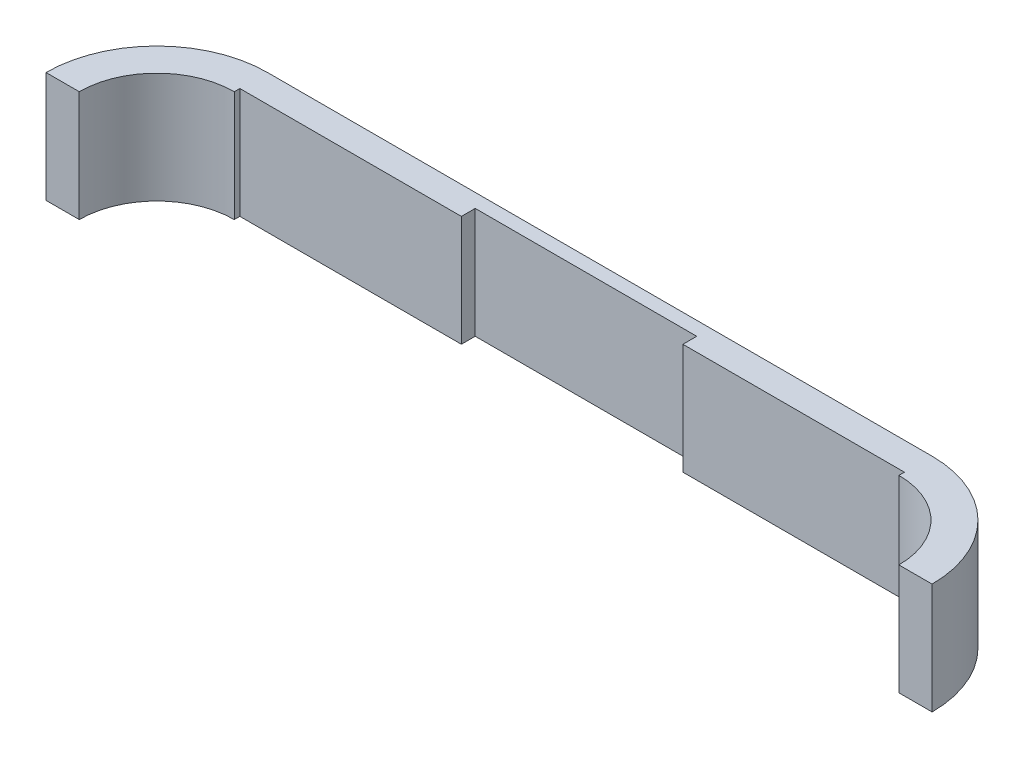
ISO-10303-21;
HEADER;
FILE_DESCRIPTION(('STEP AP214'),'2;1');
FILE_NAME('part.step','',(''),(''),'','','');
FILE_SCHEMA(('AUTOMOTIVE_DESIGN { 1 0 10303 214 1 1 1 1 }'));
ENDSEC;
DATA;
#1=APPLICATION_CONTEXT('core data for automotive mechanical design processes');
#2=APPLICATION_PROTOCOL_DEFINITION('international standard','automotive_design',2000,#1);
#3=PRODUCT_CONTEXT('',#1,'mechanical');
#4=PRODUCT('Part','Part','',(#3));
#5=PRODUCT_RELATED_PRODUCT_CATEGORY('part','',(#4));
#6=PRODUCT_DEFINITION_FORMATION('','',#4);
#7=PRODUCT_DEFINITION_CONTEXT('part definition',#1,'design');
#8=PRODUCT_DEFINITION('design','',#6,#7);
#9=PRODUCT_DEFINITION_SHAPE('','',#8);
#10=(LENGTH_UNIT() NAMED_UNIT(*) SI_UNIT(.MILLI.,.METRE.));
#11=(NAMED_UNIT(*) PLANE_ANGLE_UNIT() SI_UNIT($,.RADIAN.));
#12=(NAMED_UNIT(*) SI_UNIT($,.STERADIAN.) SOLID_ANGLE_UNIT());
#13=UNCERTAINTY_MEASURE_WITH_UNIT(LENGTH_MEASURE(1.E-05),#10,'distance_accuracy_value','');
#14=(GEOMETRIC_REPRESENTATION_CONTEXT(3) GLOBAL_UNCERTAINTY_ASSIGNED_CONTEXT((#13)) GLOBAL_UNIT_ASSIGNED_CONTEXT((#10,
#11,#12)) REPRESENTATION_CONTEXT('',''));
#15=CARTESIAN_POINT('',(0.,0.,0.));
#16=DIRECTION('',(0.,0.,1.));
#17=DIRECTION('',(1.,0.,0.));
#18=AXIS2_PLACEMENT_3D('',#15,#16,#17);
#19=CARTESIAN_POINT('',(0.,2000.,5133.84624820078));
#20=DIRECTION('',(0.,0.,-1.));
#21=DIRECTION('',(-1.,0.,0.));
#22=AXIS2_PLACEMENT_3D('',#19,#20,#21);
#23=PLANE('',#22);
#24=DIRECTION('',(1.,0.,0.));
#25=VECTOR('',#24,1.);
#26=CARTESIAN_POINT('',(0.,0.,5133.84624820078));
#27=LINE('',#26,#25);
#28=CARTESIAN_POINT('',(4435.15250386494,0.,5133.84624820078));
#29=VERTEX_POINT('',#28);
#30=CARTESIAN_POINT('',(16435.1525038649,0.,5133.84624820078));
#31=VERTEX_POINT('',#30);
#32=EDGE_CURVE('E167',#29,#31,#27,.T.);
#33=ORIENTED_EDGE('',*,*,#32,.F.);
#34=DIRECTION('',(0.,-1.,0.));
#35=VECTOR('',#34,1.);
#36=CARTESIAN_POINT('',(4435.15250386494,2000.,5133.84624820078));
#37=LINE('',#36,#35);
#38=CARTESIAN_POINT('',(4435.15250386494,2000.,5133.84624820078));
#39=VERTEX_POINT('',#38);
#40=EDGE_CURVE('E11',#39,#29,#37,.T.);
#41=ORIENTED_EDGE('',*,*,#40,.F.);
#42=DIRECTION('',(1.,0.,0.));
#43=VECTOR('',#42,1.);
#44=CARTESIAN_POINT('',(0.,2000.,5133.84624820078));
#45=LINE('',#44,#43);
#46=CARTESIAN_POINT('',(16435.1525038649,2000.,5133.84624820078));
#47=VERTEX_POINT('',#46);
#48=EDGE_CURVE('E202',#39,#47,#45,.T.);
#49=ORIENTED_EDGE('',*,*,#48,.T.);
#50=DIRECTION('',(0.,-1.,0.));
#51=VECTOR('',#50,1.);
#52=CARTESIAN_POINT('',(16435.1525038649,2000.,5133.84624820078));
#53=LINE('',#52,#51);
#54=EDGE_CURVE('E54',#47,#31,#53,.T.);
#55=ORIENTED_EDGE('',*,*,#54,.T.);
#56=EDGE_LOOP('',(#33,#41,#49,#55));
#57=FACE_BOUND('',#56,.T.);
#58=ADVANCED_FACE('F38',(#57),#23,.T.);
#59=CARTESIAN_POINT('',(4435.15250386493,2000.,7133.84624820078));
#60=DIRECTION('',(0.,-1.,0.));
#61=DIRECTION('',(0.,0.,-1.));
#62=AXIS2_PLACEMENT_3D('',#59,#60,#61);
#63=CYLINDRICAL_SURFACE('',#62,2000.);
#64=CARTESIAN_POINT('',(4435.15250386493,0.,7133.84624820078));
#65=DIRECTION('',(0.,1.,0.));
#66=DIRECTION('',(0.,0.,1.));
#67=AXIS2_PLACEMENT_3D('',#64,#65,#66);
#68=CIRCLE('',#67,2000.);
#69=CARTESIAN_POINT('',(2435.15250386493,0.,7133.84624820079));
#70=VERTEX_POINT('',#69);
#71=EDGE_CURVE('E169',#29,#70,#68,.T.);
#72=ORIENTED_EDGE('',*,*,#71,.T.);
#73=DIRECTION('',(0.,-1.,0.));
#74=VECTOR('',#73,1.);
#75=CARTESIAN_POINT('',(2435.15250386493,2000.,7133.84624820079));
#76=LINE('',#75,#74);
#77=CARTESIAN_POINT('',(2435.15250386493,2000.,7133.84624820079));
#78=VERTEX_POINT('',#77);
#79=EDGE_CURVE('E46',#78,#70,#76,.T.);
#80=ORIENTED_EDGE('',*,*,#79,.F.);
#81=CARTESIAN_POINT('',(4435.15250386493,2000.,7133.84624820078));
#82=DIRECTION('',(0.,1.,0.));
#83=DIRECTION('',(0.,0.,1.));
#84=AXIS2_PLACEMENT_3D('',#81,#82,#83);
#85=CIRCLE('',#84,2000.);
#86=EDGE_CURVE('E248',#39,#78,#85,.T.);
#87=ORIENTED_EDGE('',*,*,#86,.F.);
#88=ORIENTED_EDGE('',*,*,#40,.T.);
#89=EDGE_LOOP('',(#72,#80,#87,#88));
#90=FACE_BOUND('',#89,.T.);
#91=ADVANCED_FACE('F278',(#90),#63,.T.);
#92=CARTESIAN_POINT('',(5.06890262968853E-11,2000.,7133.84624820081));
#93=DIRECTION('',(0.,0.,-1.));
#94=DIRECTION('',(-1.,0.,0.));
#95=AXIS2_PLACEMENT_3D('',#92,#93,#94);
#96=PLANE('',#95);
#97=DIRECTION('',(1.,0.,0.));
#98=VECTOR('',#97,1.);
#99=CARTESIAN_POINT('',(5.06890262968853E-11,0.,7133.84624820081));
#100=LINE('',#99,#98);
#101=CARTESIAN_POINT('',(3035.15250386493,0.,7133.84624820079));
#102=VERTEX_POINT('',#101);
#103=EDGE_CURVE('E171',#70,#102,#100,.T.);
#104=ORIENTED_EDGE('',*,*,#103,.T.);
#105=DIRECTION('',(0.,-1.,0.));
#106=VECTOR('',#105,1.);
#107=CARTESIAN_POINT('',(3035.15250386493,2000.,7133.84624820079));
#108=LINE('',#107,#106);
#109=CARTESIAN_POINT('',(3035.15250386493,2000.,7133.84624820079));
#110=VERTEX_POINT('',#109);
#111=EDGE_CURVE('E222',#110,#102,#108,.T.);
#112=ORIENTED_EDGE('',*,*,#111,.F.);
#113=DIRECTION('',(1.,0.,0.));
#114=VECTOR('',#113,1.);
#115=CARTESIAN_POINT('',(5.06890262968853E-11,2000.,7133.84624820081));
#116=LINE('',#115,#114);
#117=EDGE_CURVE('E230',#78,#110,#116,.T.);
#118=ORIENTED_EDGE('',*,*,#117,.F.);
#119=ORIENTED_EDGE('',*,*,#79,.T.);
#120=EDGE_LOOP('',(#104,#112,#118,#119));
#121=FACE_BOUND('',#120,.T.);
#122=ADVANCED_FACE('F228',(#121),#96,.F.);
#123=CARTESIAN_POINT('',(4435.15250386493,2000.,7133.84624820078));
#124=DIRECTION('',(0.,-1.,0.));
#125=DIRECTION('',(0.,0.,-1.));
#126=AXIS2_PLACEMENT_3D('',#123,#124,#125);
#127=CYLINDRICAL_SURFACE('',#126,1400.);
#128=CARTESIAN_POINT('',(4435.15250386493,0.,7133.84624820078));
#129=DIRECTION('',(0.,1.,0.));
#130=DIRECTION('',(0.,0.,1.));
#131=AXIS2_PLACEMENT_3D('',#128,#129,#130);
#132=CIRCLE('',#131,1400.);
#133=CARTESIAN_POINT('',(4435.15250386494,0.,5733.84624820078));
#134=VERTEX_POINT('',#133);
#135=EDGE_CURVE('E174',#134,#102,#132,.T.);
#136=ORIENTED_EDGE('',*,*,#135,.F.);
#137=DIRECTION('',(0.,-1.,0.));
#138=VECTOR('',#137,1.);
#139=CARTESIAN_POINT('',(4435.15250386494,2000.,5733.84624820078));
#140=LINE('',#139,#138);
#141=CARTESIAN_POINT('',(4435.15250386494,2000.,5733.84624820078));
#142=VERTEX_POINT('',#141);
#143=EDGE_CURVE('E220',#142,#134,#140,.T.);
#144=ORIENTED_EDGE('',*,*,#143,.F.);
#145=CARTESIAN_POINT('',(4435.15250386493,2000.,7133.84624820078));
#146=DIRECTION('',(0.,1.,0.));
#147=DIRECTION('',(0.,0.,1.));
#148=AXIS2_PLACEMENT_3D('',#145,#146,#147);
#149=CIRCLE('',#148,1400.);
#150=EDGE_CURVE('E243',#142,#110,#149,.T.);
#151=ORIENTED_EDGE('',*,*,#150,.T.);
#152=ORIENTED_EDGE('',*,*,#111,.T.);
#153=EDGE_LOOP('',(#136,#144,#151,#152));
#154=FACE_BOUND('',#153,.T.);
#155=ADVANCED_FACE('F239',(#154),#127,.F.);
#156=CARTESIAN_POINT('',(4435.15250386499,2000.,3.93920674201188E-11));
#157=DIRECTION('',(-1.,0.,0.));
#158=DIRECTION('',(0.,0.,1.));
#159=AXIS2_PLACEMENT_3D('',#156,#157,#158);
#160=PLANE('',#159);
#161=DIRECTION('',(0.,0.,-1.));
#162=VECTOR('',#161,1.);
#163=CARTESIAN_POINT('',(4435.15250386499,0.,3.93920674201188E-11));
#164=LINE('',#163,#162);
#165=CARTESIAN_POINT('',(4435.15250386494,0.,5633.84624820078));
#166=VERTEX_POINT('',#165);
#167=EDGE_CURVE('E177',#134,#166,#164,.T.);
#168=ORIENTED_EDGE('',*,*,#167,.T.);
#169=DIRECTION('',(0.,-1.,0.));
#170=VECTOR('',#169,1.);
#171=CARTESIAN_POINT('',(4435.15250386494,2000.,5633.84624820078));
#172=LINE('',#171,#170);
#173=CARTESIAN_POINT('',(4435.15250386494,2000.,5633.84624820078));
#174=VERTEX_POINT('',#173);
#175=EDGE_CURVE('E217',#174,#166,#172,.T.);
#176=ORIENTED_EDGE('',*,*,#175,.F.);
#177=DIRECTION('',(0.,0.,-1.));
#178=VECTOR('',#177,1.);
#179=CARTESIAN_POINT('',(4435.15250386499,2000.,3.93920674201188E-11));
#180=LINE('',#179,#178);
#181=EDGE_CURVE('E244',#142,#174,#180,.T.);
#182=ORIENTED_EDGE('',*,*,#181,.F.);
#183=ORIENTED_EDGE('',*,*,#143,.T.);
#184=EDGE_LOOP('',(#168,#176,#182,#183));
#185=FACE_BOUND('',#184,.T.);
#186=ADVANCED_FACE('F289',(#185),#160,.F.);
#187=CARTESIAN_POINT('',(0.,2000.,5633.84624820078));
#188=DIRECTION('',(0.,0.,-1.));
#189=DIRECTION('',(-1.,0.,0.));
#190=AXIS2_PLACEMENT_3D('',#187,#188,#189);
#191=PLANE('',#190);
#192=DIRECTION('',(1.,0.,0.));
#193=VECTOR('',#192,1.);
#194=CARTESIAN_POINT('',(0.,0.,5633.84624820078));
#195=LINE('',#194,#193);
#196=CARTESIAN_POINT('',(8435.15250386493,0.,5633.84624820078));
#197=VERTEX_POINT('',#196);
#198=EDGE_CURVE('E179',#166,#197,#195,.T.);
#199=ORIENTED_EDGE('',*,*,#198,.T.);
#200=DIRECTION('',(0.,-1.,0.));
#201=VECTOR('',#200,1.);
#202=CARTESIAN_POINT('',(8435.15250386493,2000.,5633.84624820078));
#203=LINE('',#202,#201);
#204=CARTESIAN_POINT('',(8435.15250386493,2000.,5633.84624820078));
#205=VERTEX_POINT('',#204);
#206=EDGE_CURVE('E215',#205,#197,#203,.T.);
#207=ORIENTED_EDGE('',*,*,#206,.F.);
#208=DIRECTION('',(1.,0.,0.));
#209=VECTOR('',#208,1.);
#210=CARTESIAN_POINT('',(0.,2000.,5633.84624820078));
#211=LINE('',#210,#209);
#212=EDGE_CURVE('E246',#174,#205,#211,.T.);
#213=ORIENTED_EDGE('',*,*,#212,.F.);
#214=ORIENTED_EDGE('',*,*,#175,.T.);
#215=EDGE_LOOP('',(#199,#207,#213,#214));
#216=FACE_BOUND('',#215,.T.);
#217=ADVANCED_FACE('F292',(#216),#191,.F.);
#218=CARTESIAN_POINT('',(8435.15250386493,2000.,0.));
#219=DIRECTION('',(1.,0.,0.));
#220=DIRECTION('',(0.,0.,-1.));
#221=AXIS2_PLACEMENT_3D('',#218,#219,#220);
#222=PLANE('',#221);
#223=DIRECTION('',(0.,0.,1.));
#224=VECTOR('',#223,1.);
#225=CARTESIAN_POINT('',(8435.15250386493,0.,0.));
#226=LINE('',#225,#224);
#227=CARTESIAN_POINT('',(8435.15250386493,0.,5383.84624820078));
#228=VERTEX_POINT('',#227);
#229=EDGE_CURVE('E182',#228,#197,#226,.T.);
#230=ORIENTED_EDGE('',*,*,#229,.F.);
#231=DIRECTION('',(0.,-1.,0.));
#232=VECTOR('',#231,1.);
#233=CARTESIAN_POINT('',(8435.15250386493,2000.,5383.84624820078));
#234=LINE('',#233,#232);
#235=CARTESIAN_POINT('',(8435.15250386493,2000.,5383.84624820078));
#236=VERTEX_POINT('',#235);
#237=EDGE_CURVE('E213',#236,#228,#234,.T.);
#238=ORIENTED_EDGE('',*,*,#237,.F.);
#239=DIRECTION('',(0.,0.,1.));
#240=VECTOR('',#239,1.);
#241=CARTESIAN_POINT('',(8435.15250386493,2000.,0.));
#242=LINE('',#241,#240);
#243=EDGE_CURVE('E253',#236,#205,#242,.T.);
#244=ORIENTED_EDGE('',*,*,#243,.T.);
#245=ORIENTED_EDGE('',*,*,#206,.T.);
#246=EDGE_LOOP('',(#230,#238,#244,#245));
#247=FACE_BOUND('',#246,.T.);
#248=ADVANCED_FACE('F296',(#247),#222,.T.);
#249=CARTESIAN_POINT('',(0.,2000.,5383.84624820078));
#250=DIRECTION('',(0.,0.,1.));
#251=DIRECTION('',(1.,0.,0.));
#252=AXIS2_PLACEMENT_3D('',#249,#250,#251);
#253=PLANE('',#252);
#254=DIRECTION('',(-1.,0.,0.));
#255=VECTOR('',#254,1.);
#256=CARTESIAN_POINT('',(0.,0.,5383.84624820078));
#257=LINE('',#256,#255);
#258=CARTESIAN_POINT('',(12435.1525038649,0.,5383.84624820078));
#259=VERTEX_POINT('',#258);
#260=EDGE_CURVE('E185',#259,#228,#257,.T.);
#261=ORIENTED_EDGE('',*,*,#260,.F.);
#262=DIRECTION('',(0.,-1.,0.));
#263=VECTOR('',#262,1.);
#264=CARTESIAN_POINT('',(12435.1525038649,2000.,5383.84624820078));
#265=LINE('',#264,#263);
#266=CARTESIAN_POINT('',(12435.1525038649,2000.,5383.84624820078));
#267=VERTEX_POINT('',#266);
#268=EDGE_CURVE('E211',#267,#259,#265,.T.);
#269=ORIENTED_EDGE('',*,*,#268,.F.);
#270=DIRECTION('',(-1.,0.,0.));
#271=VECTOR('',#270,1.);
#272=CARTESIAN_POINT('',(0.,2000.,5383.84624820078));
#273=LINE('',#272,#271);
#274=EDGE_CURVE('E256',#267,#236,#273,.T.);
#275=ORIENTED_EDGE('',*,*,#274,.T.);
#276=ORIENTED_EDGE('',*,*,#237,.T.);
#277=EDGE_LOOP('',(#261,#269,#275,#276));
#278=FACE_BOUND('',#277,.T.);
#279=ADVANCED_FACE('F300',(#278),#253,.T.);
#280=CARTESIAN_POINT('',(12435.1525038649,2000.,0.));
#281=DIRECTION('',(1.,0.,0.));
#282=DIRECTION('',(0.,0.,-1.));
#283=AXIS2_PLACEMENT_3D('',#280,#281,#282);
#284=PLANE('',#283);
#285=DIRECTION('',(0.,0.,1.));
#286=VECTOR('',#285,1.);
#287=CARTESIAN_POINT('',(12435.1525038649,0.,0.));
#288=LINE('',#287,#286);
#289=CARTESIAN_POINT('',(12435.1525038649,0.,5633.84624820078));
#290=VERTEX_POINT('',#289);
#291=EDGE_CURVE('E188',#259,#290,#288,.T.);
#292=ORIENTED_EDGE('',*,*,#291,.T.);
#293=DIRECTION('',(0.,-1.,0.));
#294=VECTOR('',#293,1.);
#295=CARTESIAN_POINT('',(12435.1525038649,2000.,5633.84624820078));
#296=LINE('',#295,#294);
#297=CARTESIAN_POINT('',(12435.1525038649,2000.,5633.84624820078));
#298=VERTEX_POINT('',#297);
#299=EDGE_CURVE('E208',#298,#290,#296,.T.);
#300=ORIENTED_EDGE('',*,*,#299,.F.);
#301=DIRECTION('',(0.,0.,1.));
#302=VECTOR('',#301,1.);
#303=CARTESIAN_POINT('',(12435.1525038649,2000.,0.));
#304=LINE('',#303,#302);
#305=EDGE_CURVE('E259',#267,#298,#304,.T.);
#306=ORIENTED_EDGE('',*,*,#305,.F.);
#307=ORIENTED_EDGE('',*,*,#268,.T.);
#308=EDGE_LOOP('',(#292,#300,#306,#307));
#309=FACE_BOUND('',#308,.T.);
#310=ADVANCED_FACE('F304',(#309),#284,.F.);
#311=CARTESIAN_POINT('',(0.,2000.,5633.84624820078));
#312=DIRECTION('',(0.,0.,-1.));
#313=DIRECTION('',(-1.,0.,0.));
#314=AXIS2_PLACEMENT_3D('',#311,#312,#313);
#315=PLANE('',#314);
#316=DIRECTION('',(1.,0.,0.));
#317=VECTOR('',#316,1.);
#318=CARTESIAN_POINT('',(0.,0.,5633.84624820078));
#319=LINE('',#318,#317);
#320=CARTESIAN_POINT('',(16435.1525038649,0.,5633.84624820078));
#321=VERTEX_POINT('',#320);
#322=EDGE_CURVE('E190',#290,#321,#319,.T.);
#323=ORIENTED_EDGE('',*,*,#322,.T.);
#324=DIRECTION('',(0.,-1.,0.));
#325=VECTOR('',#324,1.);
#326=CARTESIAN_POINT('',(16435.1525038649,2000.,5633.84624820078));
#327=LINE('',#326,#325);
#328=CARTESIAN_POINT('',(16435.1525038649,2000.,5633.84624820078));
#329=VERTEX_POINT('',#328);
#330=EDGE_CURVE('E206',#329,#321,#327,.T.);
#331=ORIENTED_EDGE('',*,*,#330,.F.);
#332=DIRECTION('',(1.,0.,0.));
#333=VECTOR('',#332,1.);
#334=CARTESIAN_POINT('',(0.,2000.,5633.84624820078));
#335=LINE('',#334,#333);
#336=EDGE_CURVE('E261',#298,#329,#335,.T.);
#337=ORIENTED_EDGE('',*,*,#336,.F.);
#338=ORIENTED_EDGE('',*,*,#299,.T.);
#339=EDGE_LOOP('',(#323,#331,#337,#338));
#340=FACE_BOUND('',#339,.T.);
#341=ADVANCED_FACE('F308',(#340),#315,.F.);
#342=CARTESIAN_POINT('',(16435.1525038649,2000.,0.));
#343=DIRECTION('',(-1.,0.,0.));
#344=DIRECTION('',(0.,0.,1.));
#345=AXIS2_PLACEMENT_3D('',#342,#343,#344);
#346=PLANE('',#345);
#347=DIRECTION('',(0.,0.,-1.));
#348=VECTOR('',#347,1.);
#349=CARTESIAN_POINT('',(16435.1525038649,0.,0.));
#350=LINE('',#349,#348);
#351=CARTESIAN_POINT('',(16435.1525038649,0.,5733.84624820078));
#352=VERTEX_POINT('',#351);
#353=EDGE_CURVE('E193',#352,#321,#350,.T.);
#354=ORIENTED_EDGE('',*,*,#353,.F.);
#355=DIRECTION('',(0.,-1.,0.));
#356=VECTOR('',#355,1.);
#357=CARTESIAN_POINT('',(16435.1525038649,2000.,5733.84624820078));
#358=LINE('',#357,#356);
#359=CARTESIAN_POINT('',(16435.1525038649,2000.,5733.84624820078));
#360=VERTEX_POINT('',#359);
#361=EDGE_CURVE('E159',#360,#352,#358,.T.);
#362=ORIENTED_EDGE('',*,*,#361,.F.);
#363=DIRECTION('',(0.,0.,-1.));
#364=VECTOR('',#363,1.);
#365=CARTESIAN_POINT('',(16435.1525038649,2000.,0.));
#366=LINE('',#365,#364);
#367=EDGE_CURVE('E149',#360,#329,#366,.T.);
#368=ORIENTED_EDGE('',*,*,#367,.T.);
#369=ORIENTED_EDGE('',*,*,#330,.T.);
#370=EDGE_LOOP('',(#354,#362,#368,#369));
#371=FACE_BOUND('',#370,.T.);
#372=ADVANCED_FACE('F264',(#371),#346,.T.);
#373=CARTESIAN_POINT('',(16435.1525038649,2000.,7133.84624820078));
#374=DIRECTION('',(0.,-1.,0.));
#375=DIRECTION('',(0.,0.,-1.));
#376=AXIS2_PLACEMENT_3D('',#373,#374,#375);
#377=CYLINDRICAL_SURFACE('',#376,1400.);
#378=CARTESIAN_POINT('',(16435.1525038649,0.,7133.84624820078));
#379=DIRECTION('',(0.,1.,0.));
#380=DIRECTION('',(0.,0.,1.));
#381=AXIS2_PLACEMENT_3D('',#378,#379,#380);
#382=CIRCLE('',#381,1400.);
#383=CARTESIAN_POINT('',(17835.1525038649,0.,7133.84624820079));
#384=VERTEX_POINT('',#383);
#385=EDGE_CURVE('E156',#352,#384,#382,.F.);
#386=ORIENTED_EDGE('',*,*,#385,.T.);
#387=DIRECTION('',(0.,-1.,0.));
#388=VECTOR('',#387,1.);
#389=CARTESIAN_POINT('',(17835.1525038649,2000.,7133.84624820079));
#390=LINE('',#389,#388);
#391=CARTESIAN_POINT('',(17835.1525038649,2000.,7133.84624820079));
#392=VERTEX_POINT('',#391);
#393=EDGE_CURVE('E153',#392,#384,#390,.T.);
#394=ORIENTED_EDGE('',*,*,#393,.F.);
#395=CARTESIAN_POINT('',(16435.1525038649,2000.,7133.84624820078));
#396=DIRECTION('',(0.,1.,0.));
#397=DIRECTION('',(0.,0.,1.));
#398=AXIS2_PLACEMENT_3D('',#395,#396,#397);
#399=CIRCLE('',#398,1400.);
#400=EDGE_CURVE('E141',#360,#392,#399,.F.);
#401=ORIENTED_EDGE('',*,*,#400,.F.);
#402=ORIENTED_EDGE('',*,*,#361,.T.);
#403=EDGE_LOOP('',(#386,#394,#401,#402));
#404=FACE_BOUND('',#403,.T.);
#405=ADVANCED_FACE('F154',(#404),#377,.F.);
#406=CARTESIAN_POINT('',(-5.06890262968842E-11,2000.,7133.84624820066));
#407=DIRECTION('',(0.,0.,-1.));
#408=DIRECTION('',(-1.,0.,0.));
#409=AXIS2_PLACEMENT_3D('',#406,#407,#408);
#410=PLANE('',#409);
#411=DIRECTION('',(1.,0.,0.));
#412=VECTOR('',#411,1.);
#413=CARTESIAN_POINT('',(-5.06890262968842E-11,0.,7133.84624820066));
#414=LINE('',#413,#412);
#415=CARTESIAN_POINT('',(18435.1525038649,0.,7133.84624820079));
#416=VERTEX_POINT('',#415);
#417=EDGE_CURVE('E197',#384,#416,#414,.T.);
#418=ORIENTED_EDGE('',*,*,#417,.T.);
#419=DIRECTION('',(0.,-1.,0.));
#420=VECTOR('',#419,1.);
#421=CARTESIAN_POINT('',(18435.1525038649,2000.,7133.84624820079));
#422=LINE('',#421,#420);
#423=CARTESIAN_POINT('',(18435.1525038649,2000.,7133.84624820079));
#424=VERTEX_POINT('',#423);
#425=EDGE_CURVE('E98',#424,#416,#422,.T.);
#426=ORIENTED_EDGE('',*,*,#425,.F.);
#427=DIRECTION('',(1.,0.,0.));
#428=VECTOR('',#427,1.);
#429=CARTESIAN_POINT('',(-5.06890262968842E-11,2000.,7133.84624820066));
#430=LINE('',#429,#428);
#431=EDGE_CURVE('E147',#392,#424,#430,.T.);
#432=ORIENTED_EDGE('',*,*,#431,.F.);
#433=ORIENTED_EDGE('',*,*,#393,.T.);
#434=EDGE_LOOP('',(#418,#426,#432,#433));
#435=FACE_BOUND('',#434,.T.);
#436=ADVANCED_FACE('F161',(#435),#410,.F.);
#437=CARTESIAN_POINT('',(16435.1525038649,2000.,7133.84624820078));
#438=DIRECTION('',(0.,-1.,0.));
#439=DIRECTION('',(0.,0.,-1.));
#440=AXIS2_PLACEMENT_3D('',#437,#438,#439);
#441=CYLINDRICAL_SURFACE('',#440,2000.);
#442=CARTESIAN_POINT('',(16435.1525038649,0.,7133.84624820078));
#443=DIRECTION('',(0.,1.,0.));
#444=DIRECTION('',(0.,0.,1.));
#445=AXIS2_PLACEMENT_3D('',#442,#443,#444);
#446=CIRCLE('',#445,2000.);
#447=EDGE_CURVE('E199',#31,#416,#446,.F.);
#448=ORIENTED_EDGE('',*,*,#447,.F.);
#449=ORIENTED_EDGE('',*,*,#54,.F.);
#450=CARTESIAN_POINT('',(16435.1525038649,2000.,7133.84624820078));
#451=DIRECTION('',(0.,1.,0.));
#452=DIRECTION('',(0.,0.,1.));
#453=AXIS2_PLACEMENT_3D('',#450,#451,#452);
#454=CIRCLE('',#453,2000.);
#455=EDGE_CURVE('E162',#47,#424,#454,.F.);
#456=ORIENTED_EDGE('',*,*,#455,.T.);
#457=ORIENTED_EDGE('',*,*,#425,.T.);
#458=EDGE_LOOP('',(#448,#449,#456,#457));
#459=FACE_BOUND('',#458,.T.);
#460=ADVANCED_FACE('F267',(#459),#441,.T.);
#461=CARTESIAN_POINT('',(0.,2000.,0.));
#462=DIRECTION('',(0.,1.,0.));
#463=DIRECTION('',(0.,0.,1.));
#464=AXIS2_PLACEMENT_3D('',#461,#462,#463);
#465=PLANE('',#464);
#466=ORIENTED_EDGE('',*,*,#48,.F.);
#467=ORIENTED_EDGE('',*,*,#86,.T.);
#468=ORIENTED_EDGE('',*,*,#117,.T.);
#469=ORIENTED_EDGE('',*,*,#150,.F.);
#470=ORIENTED_EDGE('',*,*,#181,.T.);
#471=ORIENTED_EDGE('',*,*,#212,.T.);
#472=ORIENTED_EDGE('',*,*,#243,.F.);
#473=ORIENTED_EDGE('',*,*,#274,.F.);
#474=ORIENTED_EDGE('',*,*,#305,.T.);
#475=ORIENTED_EDGE('',*,*,#336,.T.);
#476=ORIENTED_EDGE('',*,*,#367,.F.);
#477=ORIENTED_EDGE('',*,*,#400,.T.);
#478=ORIENTED_EDGE('',*,*,#431,.T.);
#479=ORIENTED_EDGE('',*,*,#455,.F.);
#480=EDGE_LOOP('',(#466,#467,#468,#469,#470,#471,#472,#473,#474,#475,#476,#477,#478,#479));
#481=FACE_BOUND('',#480,.T.);
#482=ADVANCED_FACE('F144',(#481),#465,.T.);
#483=CARTESIAN_POINT('',(0.,0.,0.));
#484=DIRECTION('',(0.,1.,0.));
#485=DIRECTION('',(0.,0.,1.));
#486=AXIS2_PLACEMENT_3D('',#483,#484,#485);
#487=PLANE('',#486);
#488=ORIENTED_EDGE('',*,*,#32,.T.);
#489=ORIENTED_EDGE('',*,*,#447,.T.);
#490=ORIENTED_EDGE('',*,*,#417,.F.);
#491=ORIENTED_EDGE('',*,*,#385,.F.);
#492=ORIENTED_EDGE('',*,*,#353,.T.);
#493=ORIENTED_EDGE('',*,*,#322,.F.);
#494=ORIENTED_EDGE('',*,*,#291,.F.);
#495=ORIENTED_EDGE('',*,*,#260,.T.);
#496=ORIENTED_EDGE('',*,*,#229,.T.);
#497=ORIENTED_EDGE('',*,*,#198,.F.);
#498=ORIENTED_EDGE('',*,*,#167,.F.);
#499=ORIENTED_EDGE('',*,*,#135,.T.);
#500=ORIENTED_EDGE('',*,*,#103,.F.);
#501=ORIENTED_EDGE('',*,*,#71,.F.);
#502=EDGE_LOOP('',(#488,#489,#490,#491,#492,#493,#494,#495,#496,#497,#498,#499,#500,#501));
#503=FACE_BOUND('',#502,.T.);
#504=ADVANCED_FACE('F234',(#503),#487,.F.);
#505=CLOSED_SHELL('',(#58,#91,#122,#155,#186,#217,#248,#279,#310,#341,#372,#405,#436,#460,#482,#504));
#506=MANIFOLD_SOLID_BREP('B2',#505);
#507=ADVANCED_BREP_SHAPE_REPRESENTATION('',(#18,#506),#14);
#508=SHAPE_DEFINITION_REPRESENTATION(#9,#507);
ENDSEC;
END-ISO-10303-21;
